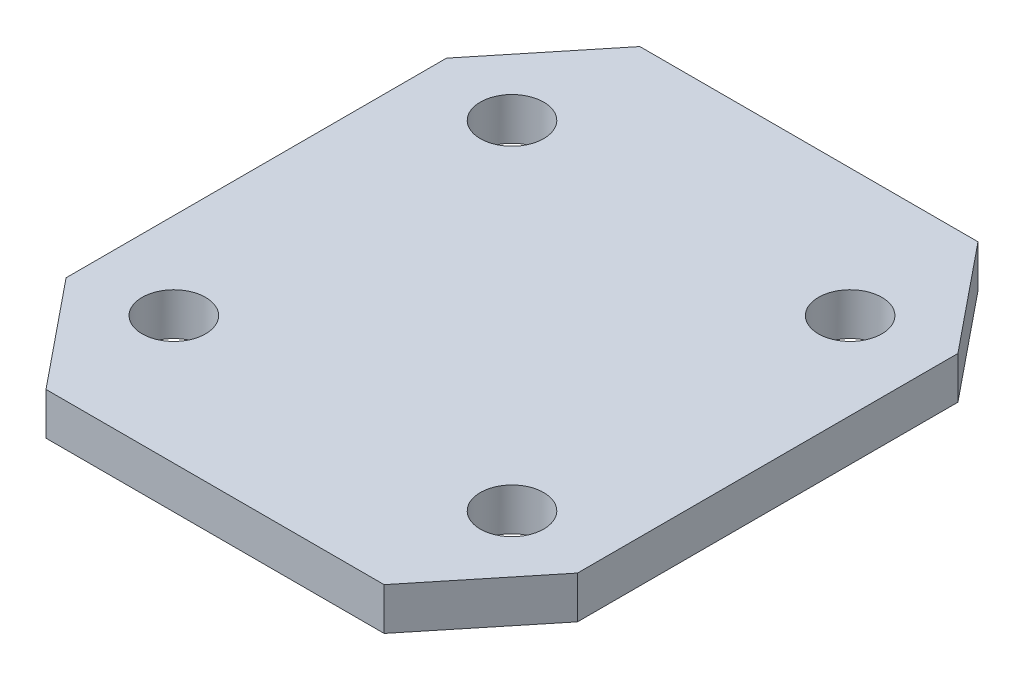
ISO-10303-21;
HEADER;
FILE_DESCRIPTION(('STEP AP214'),'2;1');
FILE_NAME('part.step','',(''),(''),'','','');
FILE_SCHEMA(('AUTOMOTIVE_DESIGN { 1 0 10303 214 1 1 1 1 }'));
ENDSEC;
DATA;
#1=APPLICATION_CONTEXT('core data for automotive mechanical design processes');
#2=APPLICATION_PROTOCOL_DEFINITION('international standard','automotive_design',2000,#1);
#3=PRODUCT_CONTEXT('',#1,'mechanical');
#4=PRODUCT('Part','Part','',(#3));
#5=PRODUCT_RELATED_PRODUCT_CATEGORY('part','',(#4));
#6=PRODUCT_DEFINITION_FORMATION('','',#4);
#7=PRODUCT_DEFINITION_CONTEXT('part definition',#1,'design');
#8=PRODUCT_DEFINITION('design','',#6,#7);
#9=PRODUCT_DEFINITION_SHAPE('','',#8);
#10=(LENGTH_UNIT() NAMED_UNIT(*) SI_UNIT(.MILLI.,.METRE.));
#11=(NAMED_UNIT(*) PLANE_ANGLE_UNIT() SI_UNIT($,.RADIAN.));
#12=(NAMED_UNIT(*) SI_UNIT($,.STERADIAN.) SOLID_ANGLE_UNIT());
#13=UNCERTAINTY_MEASURE_WITH_UNIT(LENGTH_MEASURE(1.E-05),#10,'distance_accuracy_value','');
#14=(GEOMETRIC_REPRESENTATION_CONTEXT(3) GLOBAL_UNCERTAINTY_ASSIGNED_CONTEXT((#13)) GLOBAL_UNIT_ASSIGNED_CONTEXT((#10,
#11,#12)) REPRESENTATION_CONTEXT('',''));
#15=CARTESIAN_POINT('',(0.,0.,0.));
#16=DIRECTION('',(0.,0.,1.));
#17=DIRECTION('',(1.,0.,0.));
#18=AXIS2_PLACEMENT_3D('',#15,#16,#17);
#19=CARTESIAN_POINT('',(-12.1,2.,9.));
#20=DIRECTION('',(1.,0.,0.));
#21=DIRECTION('',(0.,0.,-1.));
#22=AXIS2_PLACEMENT_3D('',#19,#20,#21);
#23=PLANE('',#22);
#24=DIRECTION('',(0.,0.,1.));
#25=VECTOR('',#24,1.);
#26=CARTESIAN_POINT('',(-12.1,0.,9.));
#27=LINE('',#26,#25);
#28=CARTESIAN_POINT('',(-12.1,0.,-9.));
#29=VERTEX_POINT('',#28);
#30=CARTESIAN_POINT('',(-12.1,0.,9.));
#31=VERTEX_POINT('',#30);
#32=EDGE_CURVE('E142',#29,#31,#27,.T.);
#33=ORIENTED_EDGE('',*,*,#32,.T.);
#34=DIRECTION('',(0.,-1.,0.));
#35=VECTOR('',#34,1.);
#36=CARTESIAN_POINT('',(-12.1,2.,9.));
#37=LINE('',#36,#35);
#38=CARTESIAN_POINT('',(-12.1,2.,9.));
#39=VERTEX_POINT('',#38);
#40=EDGE_CURVE('E11',#39,#31,#37,.T.);
#41=ORIENTED_EDGE('',*,*,#40,.F.);
#42=DIRECTION('',(0.,0.,1.));
#43=VECTOR('',#42,1.);
#44=CARTESIAN_POINT('',(-12.1,2.,9.));
#45=LINE('',#44,#43);
#46=CARTESIAN_POINT('',(-12.1,2.,-9.));
#47=VERTEX_POINT('',#46);
#48=EDGE_CURVE('E164',#47,#39,#45,.T.);
#49=ORIENTED_EDGE('',*,*,#48,.F.);
#50=DIRECTION('',(0.,-1.,0.));
#51=VECTOR('',#50,1.);
#52=CARTESIAN_POINT('',(-12.1,2.,-9.));
#53=LINE('',#52,#51);
#54=EDGE_CURVE('E138',#47,#29,#53,.T.);
#55=ORIENTED_EDGE('',*,*,#54,.T.);
#56=EDGE_LOOP('',(#33,#41,#49,#55));
#57=FACE_BOUND('',#56,.T.);
#58=ADVANCED_FACE('F39',(#57),#23,.F.);
#59=CARTESIAN_POINT('',(-12.1,2.,9.));
#60=DIRECTION('',(0.776349066444329,0.,-0.630303202459752));
#61=DIRECTION('',(-0.630303202459752,0.,-0.776349066444329));
#62=AXIS2_PLACEMENT_3D('',#59,#60,#61);
#63=PLANE('',#62);
#64=DIRECTION('',(0.630303202459752,0.,0.776349066444329));
#65=VECTOR('',#64,1.);
#66=CARTESIAN_POINT('',(-12.1,0.,9.));
#67=LINE('',#66,#65);
#68=CARTESIAN_POINT('',(-8.,0.,14.05));
#69=VERTEX_POINT('',#68);
#70=EDGE_CURVE('E146',#31,#69,#67,.T.);
#71=ORIENTED_EDGE('',*,*,#70,.T.);
#72=DIRECTION('',(0.,-1.,0.));
#73=VECTOR('',#72,1.);
#74=CARTESIAN_POINT('',(-8.,2.,14.05));
#75=LINE('',#74,#73);
#76=CARTESIAN_POINT('',(-8.,2.,14.05));
#77=VERTEX_POINT('',#76);
#78=EDGE_CURVE('E49',#77,#69,#75,.T.);
#79=ORIENTED_EDGE('',*,*,#78,.F.);
#80=DIRECTION('',(0.630303202459752,0.,0.776349066444329));
#81=VECTOR('',#80,1.);
#82=CARTESIAN_POINT('',(-12.1,2.,9.));
#83=LINE('',#82,#81);
#84=EDGE_CURVE('E101',#39,#77,#83,.T.);
#85=ORIENTED_EDGE('',*,*,#84,.F.);
#86=ORIENTED_EDGE('',*,*,#40,.T.);
#87=EDGE_LOOP('',(#71,#79,#85,#86));
#88=FACE_BOUND('',#87,.T.);
#89=ADVANCED_FACE('F228',(#88),#63,.F.);
#90=CARTESIAN_POINT('',(-8.,2.,14.05));
#91=DIRECTION('',(0.,0.,-1.));
#92=DIRECTION('',(-1.,0.,0.));
#93=AXIS2_PLACEMENT_3D('',#90,#91,#92);
#94=PLANE('',#93);
#95=DIRECTION('',(1.,0.,0.));
#96=VECTOR('',#95,1.);
#97=CARTESIAN_POINT('',(-8.,0.,14.05));
#98=LINE('',#97,#96);
#99=CARTESIAN_POINT('',(8.,0.,14.05));
#100=VERTEX_POINT('',#99);
#101=EDGE_CURVE('E149',#69,#100,#98,.T.);
#102=ORIENTED_EDGE('',*,*,#101,.T.);
#103=DIRECTION('',(0.,-1.,0.));
#104=VECTOR('',#103,1.);
#105=CARTESIAN_POINT('',(8.,2.,14.05));
#106=LINE('',#105,#104);
#107=CARTESIAN_POINT('',(8.,2.,14.05));
#108=VERTEX_POINT('',#107);
#109=EDGE_CURVE('E175',#108,#100,#106,.T.);
#110=ORIENTED_EDGE('',*,*,#109,.F.);
#111=DIRECTION('',(1.,0.,0.));
#112=VECTOR('',#111,1.);
#113=CARTESIAN_POINT('',(-8.,2.,14.05));
#114=LINE('',#113,#112);
#115=EDGE_CURVE('E335',#77,#108,#114,.T.);
#116=ORIENTED_EDGE('',*,*,#115,.F.);
#117=ORIENTED_EDGE('',*,*,#78,.T.);
#118=EDGE_LOOP('',(#102,#110,#116,#117));
#119=FACE_BOUND('',#118,.T.);
#120=ADVANCED_FACE('F232',(#119),#94,.F.);
#121=CARTESIAN_POINT('',(8.,2.,14.05));
#122=DIRECTION('',(-0.776349066444329,0.,-0.630303202459752));
#123=DIRECTION('',(-0.630303202459752,0.,0.776349066444329));
#124=AXIS2_PLACEMENT_3D('',#121,#122,#123);
#125=PLANE('',#124);
#126=DIRECTION('',(0.630303202459752,0.,-0.776349066444329));
#127=VECTOR('',#126,1.);
#128=CARTESIAN_POINT('',(8.,0.,14.05));
#129=LINE('',#128,#127);
#130=CARTESIAN_POINT('',(12.1,0.,9.));
#131=VERTEX_POINT('',#130);
#132=EDGE_CURVE('E152',#100,#131,#129,.T.);
#133=ORIENTED_EDGE('',*,*,#132,.T.);
#134=DIRECTION('',(0.,-1.,0.));
#135=VECTOR('',#134,1.);
#136=CARTESIAN_POINT('',(12.1,2.,9.));
#137=LINE('',#136,#135);
#138=CARTESIAN_POINT('',(12.1,2.,9.));
#139=VERTEX_POINT('',#138);
#140=EDGE_CURVE('E171',#139,#131,#137,.T.);
#141=ORIENTED_EDGE('',*,*,#140,.F.);
#142=DIRECTION('',(0.630303202459752,0.,-0.776349066444329));
#143=VECTOR('',#142,1.);
#144=CARTESIAN_POINT('',(8.,2.,14.05));
#145=LINE('',#144,#143);
#146=EDGE_CURVE('E338',#108,#139,#145,.T.);
#147=ORIENTED_EDGE('',*,*,#146,.F.);
#148=ORIENTED_EDGE('',*,*,#109,.T.);
#149=EDGE_LOOP('',(#133,#141,#147,#148));
#150=FACE_BOUND('',#149,.T.);
#151=ADVANCED_FACE('F236',(#150),#125,.F.);
#152=CARTESIAN_POINT('',(12.1,2.,9.));
#153=DIRECTION('',(-1.,0.,0.));
#154=DIRECTION('',(0.,0.,1.));
#155=AXIS2_PLACEMENT_3D('',#152,#153,#154);
#156=PLANE('',#155);
#157=DIRECTION('',(0.,0.,-1.));
#158=VECTOR('',#157,1.);
#159=CARTESIAN_POINT('',(12.1,0.,9.));
#160=LINE('',#159,#158);
#161=CARTESIAN_POINT('',(12.1,0.,-9.));
#162=VERTEX_POINT('',#161);
#163=EDGE_CURVE('E155',#131,#162,#160,.T.);
#164=ORIENTED_EDGE('',*,*,#163,.T.);
#165=DIRECTION('',(0.,-1.,0.));
#166=VECTOR('',#165,1.);
#167=CARTESIAN_POINT('',(12.1,2.,-9.));
#168=LINE('',#167,#166);
#169=CARTESIAN_POINT('',(12.1,2.,-9.));
#170=VERTEX_POINT('',#169);
#171=EDGE_CURVE('E131',#170,#162,#168,.T.);
#172=ORIENTED_EDGE('',*,*,#171,.F.);
#173=DIRECTION('',(0.,0.,-1.));
#174=VECTOR('',#173,1.);
#175=CARTESIAN_POINT('',(12.1,2.,9.));
#176=LINE('',#175,#174);
#177=EDGE_CURVE('E120',#139,#170,#176,.T.);
#178=ORIENTED_EDGE('',*,*,#177,.F.);
#179=ORIENTED_EDGE('',*,*,#140,.T.);
#180=EDGE_LOOP('',(#164,#172,#178,#179));
#181=FACE_BOUND('',#180,.T.);
#182=ADVANCED_FACE('F242',(#181),#156,.F.);
#183=CARTESIAN_POINT('',(8.,2.,-14.05));
#184=DIRECTION('',(-0.776349066444329,0.,0.630303202459752));
#185=DIRECTION('',(0.630303202459752,0.,0.776349066444329));
#186=AXIS2_PLACEMENT_3D('',#183,#184,#185);
#187=PLANE('',#186);
#188=DIRECTION('',(-0.630303202459752,0.,-0.776349066444329));
#189=VECTOR('',#188,1.);
#190=CARTESIAN_POINT('',(8.,0.,-14.05));
#191=LINE('',#190,#189);
#192=CARTESIAN_POINT('',(8.,0.,-14.05));
#193=VERTEX_POINT('',#192);
#194=EDGE_CURVE('E129',#162,#193,#191,.T.);
#195=ORIENTED_EDGE('',*,*,#194,.T.);
#196=DIRECTION('',(0.,-1.,0.));
#197=VECTOR('',#196,1.);
#198=CARTESIAN_POINT('',(8.,2.,-14.05));
#199=LINE('',#198,#197);
#200=CARTESIAN_POINT('',(8.,2.,-14.05));
#201=VERTEX_POINT('',#200);
#202=EDGE_CURVE('E126',#201,#193,#199,.T.);
#203=ORIENTED_EDGE('',*,*,#202,.F.);
#204=DIRECTION('',(-0.630303202459752,0.,-0.776349066444329));
#205=VECTOR('',#204,1.);
#206=CARTESIAN_POINT('',(8.,2.,-14.05));
#207=LINE('',#206,#205);
#208=EDGE_CURVE('E114',#170,#201,#207,.T.);
#209=ORIENTED_EDGE('',*,*,#208,.F.);
#210=ORIENTED_EDGE('',*,*,#171,.T.);
#211=EDGE_LOOP('',(#195,#203,#209,#210));
#212=FACE_BOUND('',#211,.T.);
#213=ADVANCED_FACE('F127',(#212),#187,.F.);
#214=CARTESIAN_POINT('',(-8.,2.,-14.05));
#215=DIRECTION('',(0.,0.,1.));
#216=DIRECTION('',(1.,0.,0.));
#217=AXIS2_PLACEMENT_3D('',#214,#215,#216);
#218=PLANE('',#217);
#219=DIRECTION('',(-1.,0.,0.));
#220=VECTOR('',#219,1.);
#221=CARTESIAN_POINT('',(-8.,0.,-14.05));
#222=LINE('',#221,#220);
#223=CARTESIAN_POINT('',(-8.,0.,-14.05));
#224=VERTEX_POINT('',#223);
#225=EDGE_CURVE('E87',#193,#224,#222,.T.);
#226=ORIENTED_EDGE('',*,*,#225,.T.);
#227=DIRECTION('',(0.,-1.,0.));
#228=VECTOR('',#227,1.);
#229=CARTESIAN_POINT('',(-8.,2.,-14.05));
#230=LINE('',#229,#228);
#231=CARTESIAN_POINT('',(-8.,2.,-14.05));
#232=VERTEX_POINT('',#231);
#233=EDGE_CURVE('E132',#232,#224,#230,.T.);
#234=ORIENTED_EDGE('',*,*,#233,.F.);
#235=DIRECTION('',(-1.,0.,0.));
#236=VECTOR('',#235,1.);
#237=CARTESIAN_POINT('',(-8.,2.,-14.05));
#238=LINE('',#237,#236);
#239=EDGE_CURVE('E118',#201,#232,#238,.T.);
#240=ORIENTED_EDGE('',*,*,#239,.F.);
#241=ORIENTED_EDGE('',*,*,#202,.T.);
#242=EDGE_LOOP('',(#226,#234,#240,#241));
#243=FACE_BOUND('',#242,.T.);
#244=ADVANCED_FACE('F134',(#243),#218,.F.);
#245=CARTESIAN_POINT('',(-12.1,2.,-9.));
#246=DIRECTION('',(0.776349066444329,0.,0.630303202459752));
#247=DIRECTION('',(0.630303202459752,0.,-0.776349066444329));
#248=AXIS2_PLACEMENT_3D('',#245,#246,#247);
#249=PLANE('',#248);
#250=DIRECTION('',(-0.630303202459752,0.,0.776349066444329));
#251=VECTOR('',#250,1.);
#252=CARTESIAN_POINT('',(-12.1,0.,-9.));
#253=LINE('',#252,#251);
#254=EDGE_CURVE('E93',#224,#29,#253,.T.);
#255=ORIENTED_EDGE('',*,*,#254,.T.);
#256=ORIENTED_EDGE('',*,*,#54,.F.);
#257=DIRECTION('',(-0.630303202459752,0.,0.776349066444329));
#258=VECTOR('',#257,1.);
#259=CARTESIAN_POINT('',(-12.1,2.,-9.));
#260=LINE('',#259,#258);
#261=EDGE_CURVE('E58',#232,#47,#260,.T.);
#262=ORIENTED_EDGE('',*,*,#261,.F.);
#263=ORIENTED_EDGE('',*,*,#233,.T.);
#264=EDGE_LOOP('',(#255,#256,#262,#263));
#265=FACE_BOUND('',#264,.T.);
#266=ADVANCED_FACE('F217',(#265),#249,.F.);
#267=CARTESIAN_POINT('',(0.,2.,0.));
#268=DIRECTION('',(0.,-1.,0.));
#269=DIRECTION('',(0.,0.,-1.));
#270=AXIS2_PLACEMENT_3D('',#267,#268,#269);
#271=PLANE('',#270);
#272=CARTESIAN_POINT('',(8.,2.,-8.));
#273=DIRECTION('',(0.,1.,0.));
#274=DIRECTION('',(0.,0.,1.));
#275=AXIS2_PLACEMENT_3D('',#272,#273,#274);
#276=CIRCLE('',#275,1.5);
#277=CARTESIAN_POINT('',(8.,2.,-6.5));
#278=VERTEX_POINT('',#277);
#279=EDGE_CURVE('E318',#278,#278,#276,.T.);
#280=ORIENTED_EDGE('',*,*,#279,.F.);
#281=EDGE_LOOP('',(#280));
#282=FACE_BOUND('',#281,.T.);
#283=CARTESIAN_POINT('',(-8.,2.,8.));
#284=DIRECTION('',(0.,1.,0.));
#285=DIRECTION('',(0.,0.,1.));
#286=AXIS2_PLACEMENT_3D('',#283,#284,#285);
#287=CIRCLE('',#286,1.5);
#288=CARTESIAN_POINT('',(-8.,2.,9.5));
#289=VERTEX_POINT('',#288);
#290=EDGE_CURVE('E315',#289,#289,#287,.T.);
#291=ORIENTED_EDGE('',*,*,#290,.F.);
#292=EDGE_LOOP('',(#291));
#293=FACE_BOUND('',#292,.T.);
#294=CARTESIAN_POINT('',(8.,2.,8.));
#295=DIRECTION('',(0.,1.,0.));
#296=DIRECTION('',(0.,0.,1.));
#297=AXIS2_PLACEMENT_3D('',#294,#295,#296);
#298=CIRCLE('',#297,1.5);
#299=CARTESIAN_POINT('',(8.,2.,9.5));
#300=VERTEX_POINT('',#299);
#301=EDGE_CURVE('E319',#300,#300,#298,.T.);
#302=ORIENTED_EDGE('',*,*,#301,.F.);
#303=EDGE_LOOP('',(#302));
#304=FACE_BOUND('',#303,.T.);
#305=CARTESIAN_POINT('',(-8.,2.,-8.));
#306=DIRECTION('',(0.,1.,0.));
#307=DIRECTION('',(0.,0.,1.));
#308=AXIS2_PLACEMENT_3D('',#305,#306,#307);
#309=CIRCLE('',#308,1.5);
#310=CARTESIAN_POINT('',(-8.,2.,-6.5));
#311=VERTEX_POINT('',#310);
#312=EDGE_CURVE('E187',#311,#311,#309,.T.);
#313=ORIENTED_EDGE('',*,*,#312,.F.);
#314=EDGE_LOOP('',(#313));
#315=FACE_BOUND('',#314,.T.);
#316=ORIENTED_EDGE('',*,*,#48,.T.);
#317=ORIENTED_EDGE('',*,*,#84,.T.);
#318=ORIENTED_EDGE('',*,*,#115,.T.);
#319=ORIENTED_EDGE('',*,*,#146,.T.);
#320=ORIENTED_EDGE('',*,*,#177,.T.);
#321=ORIENTED_EDGE('',*,*,#208,.T.);
#322=ORIENTED_EDGE('',*,*,#239,.T.);
#323=ORIENTED_EDGE('',*,*,#261,.T.);
#324=EDGE_LOOP('',(#316,#317,#318,#319,#320,#321,#322,#323));
#325=FACE_BOUND('',#324,.T.);
#326=ADVANCED_FACE('F116',(#282,#293,#304,#315,#325),#271,.F.);
#327=CARTESIAN_POINT('',(0.,0.,0.));
#328=DIRECTION('',(0.,-1.,0.));
#329=DIRECTION('',(0.,0.,-1.));
#330=AXIS2_PLACEMENT_3D('',#327,#328,#329);
#331=PLANE('',#330);
#332=CARTESIAN_POINT('',(8.,0.,-8.));
#333=DIRECTION('',(0.,-1.,0.));
#334=DIRECTION('',(0.,0.,-1.));
#335=AXIS2_PLACEMENT_3D('',#332,#333,#334);
#336=CIRCLE('',#335,1.5);
#337=CARTESIAN_POINT('',(8.,0.,-9.5));
#338=VERTEX_POINT('',#337);
#339=EDGE_CURVE('E42',#338,#338,#336,.T.);
#340=ORIENTED_EDGE('',*,*,#339,.F.);
#341=EDGE_LOOP('',(#340));
#342=FACE_BOUND('',#341,.T.);
#343=CARTESIAN_POINT('',(-8.,0.,8.));
#344=DIRECTION('',(0.,-1.,0.));
#345=DIRECTION('',(0.,0.,-1.));
#346=AXIS2_PLACEMENT_3D('',#343,#344,#345);
#347=CIRCLE('',#346,1.5);
#348=CARTESIAN_POINT('',(-8.,0.,6.5));
#349=VERTEX_POINT('',#348);
#350=EDGE_CURVE('E190',#349,#349,#347,.T.);
#351=ORIENTED_EDGE('',*,*,#350,.F.);
#352=EDGE_LOOP('',(#351));
#353=FACE_BOUND('',#352,.T.);
#354=CARTESIAN_POINT('',(8.,0.,8.));
#355=DIRECTION('',(0.,-1.,0.));
#356=DIRECTION('',(0.,0.,-1.));
#357=AXIS2_PLACEMENT_3D('',#354,#355,#356);
#358=CIRCLE('',#357,1.5);
#359=CARTESIAN_POINT('',(8.,0.,6.5));
#360=VERTEX_POINT('',#359);
#361=EDGE_CURVE('E186',#360,#360,#358,.T.);
#362=ORIENTED_EDGE('',*,*,#361,.F.);
#363=EDGE_LOOP('',(#362));
#364=FACE_BOUND('',#363,.T.);
#365=CARTESIAN_POINT('',(-8.,0.,-8.));
#366=DIRECTION('',(0.,-1.,0.));
#367=DIRECTION('',(0.,0.,-1.));
#368=AXIS2_PLACEMENT_3D('',#365,#366,#367);
#369=CIRCLE('',#368,1.5);
#370=CARTESIAN_POINT('',(-8.,0.,-9.5));
#371=VERTEX_POINT('',#370);
#372=EDGE_CURVE('E182',#371,#371,#369,.T.);
#373=ORIENTED_EDGE('',*,*,#372,.F.);
#374=EDGE_LOOP('',(#373));
#375=FACE_BOUND('',#374,.T.);
#376=ORIENTED_EDGE('',*,*,#32,.F.);
#377=ORIENTED_EDGE('',*,*,#254,.F.);
#378=ORIENTED_EDGE('',*,*,#225,.F.);
#379=ORIENTED_EDGE('',*,*,#194,.F.);
#380=ORIENTED_EDGE('',*,*,#163,.F.);
#381=ORIENTED_EDGE('',*,*,#132,.F.);
#382=ORIENTED_EDGE('',*,*,#101,.F.);
#383=ORIENTED_EDGE('',*,*,#70,.F.);
#384=EDGE_LOOP('',(#376,#377,#378,#379,#380,#381,#382,#383));
#385=FACE_BOUND('',#384,.T.);
#386=ADVANCED_FACE('F202',(#342,#353,#364,#375,#385),#331,.T.);
#387=CARTESIAN_POINT('',(-8.,-8.,-8.));
#388=DIRECTION('',(0.,1.,0.));
#389=DIRECTION('',(0.,0.,1.));
#390=AXIS2_PLACEMENT_3D('',#387,#388,#389);
#391=CYLINDRICAL_SURFACE('',#390,1.5);
#392=ORIENTED_EDGE('',*,*,#372,.T.);
#393=EDGE_LOOP('',(#392));
#394=FACE_BOUND('',#393,.T.);
#395=ORIENTED_EDGE('',*,*,#312,.T.);
#396=EDGE_LOOP('',(#395));
#397=FACE_BOUND('',#396,.T.);
#398=ADVANCED_FACE('F205',(#394,#397),#391,.F.);
#399=CARTESIAN_POINT('',(8.,-8.,8.));
#400=DIRECTION('',(0.,1.,0.));
#401=DIRECTION('',(0.,0.,1.));
#402=AXIS2_PLACEMENT_3D('',#399,#400,#401);
#403=CYLINDRICAL_SURFACE('',#402,1.5);
#404=ORIENTED_EDGE('',*,*,#361,.T.);
#405=EDGE_LOOP('',(#404));
#406=FACE_BOUND('',#405,.T.);
#407=ORIENTED_EDGE('',*,*,#301,.T.);
#408=EDGE_LOOP('',(#407));
#409=FACE_BOUND('',#408,.T.);
#410=ADVANCED_FACE('F281',(#406,#409),#403,.F.);
#411=CARTESIAN_POINT('',(-8.,-8.,8.));
#412=DIRECTION('',(0.,1.,0.));
#413=DIRECTION('',(0.,0.,1.));
#414=AXIS2_PLACEMENT_3D('',#411,#412,#413);
#415=CYLINDRICAL_SURFACE('',#414,1.5);
#416=ORIENTED_EDGE('',*,*,#350,.T.);
#417=EDGE_LOOP('',(#416));
#418=FACE_BOUND('',#417,.T.);
#419=ORIENTED_EDGE('',*,*,#290,.T.);
#420=EDGE_LOOP('',(#419));
#421=FACE_BOUND('',#420,.T.);
#422=ADVANCED_FACE('F291',(#418,#421),#415,.F.);
#423=CARTESIAN_POINT('',(8.,-8.,-8.));
#424=DIRECTION('',(0.,1.,0.));
#425=DIRECTION('',(0.,0.,1.));
#426=AXIS2_PLACEMENT_3D('',#423,#424,#425);
#427=CYLINDRICAL_SURFACE('',#426,1.5);
#428=ORIENTED_EDGE('',*,*,#339,.T.);
#429=EDGE_LOOP('',(#428));
#430=FACE_BOUND('',#429,.T.);
#431=ORIENTED_EDGE('',*,*,#279,.T.);
#432=EDGE_LOOP('',(#431));
#433=FACE_BOUND('',#432,.T.);
#434=ADVANCED_FACE('F199',(#430,#433),#427,.F.);
#435=CLOSED_SHELL('',(#58,#89,#120,#151,#182,#213,#244,#266,#326,#386,#398,#410,#422,#434));
#436=MANIFOLD_SOLID_BREP('B2',#435);
#437=ADVANCED_BREP_SHAPE_REPRESENTATION('',(#18,#436),#14);
#438=SHAPE_DEFINITION_REPRESENTATION(#9,#437);
ENDSEC;
END-ISO-10303-21;
